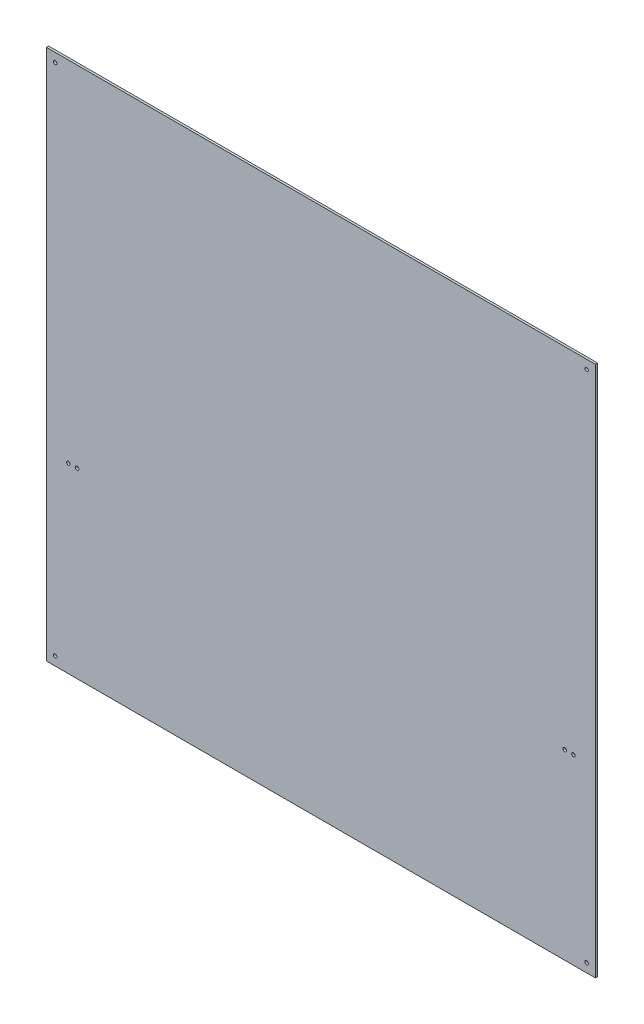
ISO-10303-21;
HEADER;
FILE_DESCRIPTION(('STEP AP214'),'2;1');
FILE_NAME('part.step','',(''),(''),'','','');
FILE_SCHEMA(('AUTOMOTIVE_DESIGN { 1 0 10303 214 1 1 1 1 }'));
ENDSEC;
DATA;
#1=APPLICATION_CONTEXT('core data for automotive mechanical design processes');
#2=APPLICATION_PROTOCOL_DEFINITION('international standard','automotive_design',2000,#1);
#3=PRODUCT_CONTEXT('',#1,'mechanical');
#4=PRODUCT('Part','Part','',(#3));
#5=PRODUCT_RELATED_PRODUCT_CATEGORY('part','',(#4));
#6=PRODUCT_DEFINITION_FORMATION('','',#4);
#7=PRODUCT_DEFINITION_CONTEXT('part definition',#1,'design');
#8=PRODUCT_DEFINITION('design','',#6,#7);
#9=PRODUCT_DEFINITION_SHAPE('','',#8);
#10=(LENGTH_UNIT() NAMED_UNIT(*) SI_UNIT(.MILLI.,.METRE.));
#11=(NAMED_UNIT(*) PLANE_ANGLE_UNIT() SI_UNIT($,.RADIAN.));
#12=(NAMED_UNIT(*) SI_UNIT($,.STERADIAN.) SOLID_ANGLE_UNIT());
#13=UNCERTAINTY_MEASURE_WITH_UNIT(LENGTH_MEASURE(1.E-05),#10,'distance_accuracy_value','');
#14=(GEOMETRIC_REPRESENTATION_CONTEXT(3) GLOBAL_UNCERTAINTY_ASSIGNED_CONTEXT((#13)) GLOBAL_UNIT_ASSIGNED_CONTEXT((#10,
#11,#12)) REPRESENTATION_CONTEXT('',''));
#15=CARTESIAN_POINT('',(0.,0.,0.));
#16=DIRECTION('',(0.,0.,1.));
#17=DIRECTION('',(1.,0.,0.));
#18=AXIS2_PLACEMENT_3D('',#15,#16,#17);
#19=CARTESIAN_POINT('',(-653.566371681416,554.672566371681,5.));
#20=DIRECTION('',(1.,0.,0.));
#21=DIRECTION('',(0.,1.,0.));
#22=AXIS2_PLACEMENT_3D('',#19,#20,#21);
#23=PLANE('',#22);
#24=DIRECTION('',(0.,-1.,0.));
#25=VECTOR('',#24,1.);
#26=CARTESIAN_POINT('',(-653.566371681416,554.672566371681,0.));
#27=LINE('',#26,#25);
#28=CARTESIAN_POINT('',(-653.566371681416,554.672566371681,0.));
#29=VERTEX_POINT('',#28);
#30=CARTESIAN_POINT('',(-653.566371681416,-655.327433628319,0.));
#31=VERTEX_POINT('',#30);
#32=EDGE_CURVE('E98',#29,#31,#27,.T.);
#33=ORIENTED_EDGE('',*,*,#32,.T.);
#34=DIRECTION('',(0.,0.,-1.));
#35=VECTOR('',#34,1.);
#36=CARTESIAN_POINT('',(-653.566371681416,-655.327433628319,5.));
#37=LINE('',#36,#35);
#38=CARTESIAN_POINT('',(-653.566371681416,-655.327433628319,5.));
#39=VERTEX_POINT('',#38);
#40=EDGE_CURVE('E11',#39,#31,#37,.T.);
#41=ORIENTED_EDGE('',*,*,#40,.F.);
#42=DIRECTION('',(0.,-1.,0.));
#43=VECTOR('',#42,1.);
#44=CARTESIAN_POINT('',(-653.566371681416,554.672566371681,5.));
#45=LINE('',#44,#43);
#46=CARTESIAN_POINT('',(-653.566371681416,554.672566371681,5.));
#47=VERTEX_POINT('',#46);
#48=EDGE_CURVE('E84',#47,#39,#45,.T.);
#49=ORIENTED_EDGE('',*,*,#48,.F.);
#50=DIRECTION('',(0.,0.,-1.));
#51=VECTOR('',#50,1.);
#52=CARTESIAN_POINT('',(-653.566371681416,554.672566371681,5.));
#53=LINE('',#52,#51);
#54=EDGE_CURVE('E51',#47,#29,#53,.T.);
#55=ORIENTED_EDGE('',*,*,#54,.T.);
#56=EDGE_LOOP('',(#33,#41,#49,#55));
#57=FACE_BOUND('',#56,.T.);
#58=ADVANCED_FACE('F35',(#57),#23,.F.);
#59=CARTESIAN_POINT('',(-653.566371681416,-655.327433628319,5.));
#60=DIRECTION('',(0.,1.,0.));
#61=DIRECTION('',(0.,0.,1.));
#62=AXIS2_PLACEMENT_3D('',#59,#60,#61);
#63=PLANE('',#62);
#64=DIRECTION('',(1.,0.,0.));
#65=VECTOR('',#64,1.);
#66=CARTESIAN_POINT('',(-653.566371681416,-655.327433628319,0.));
#67=LINE('',#66,#65);
#68=CARTESIAN_POINT('',(596.433628318584,-655.327433628319,0.));
#69=VERTEX_POINT('',#68);
#70=EDGE_CURVE('E89',#31,#69,#67,.T.);
#71=ORIENTED_EDGE('',*,*,#70,.T.);
#72=DIRECTION('',(0.,0.,-1.));
#73=VECTOR('',#72,1.);
#74=CARTESIAN_POINT('',(596.433628318584,-655.327433628319,5.));
#75=LINE('',#74,#73);
#76=CARTESIAN_POINT('',(596.433628318584,-655.327433628319,5.));
#77=VERTEX_POINT('',#76);
#78=EDGE_CURVE('E43',#77,#69,#75,.T.);
#79=ORIENTED_EDGE('',*,*,#78,.F.);
#80=DIRECTION('',(1.,0.,0.));
#81=VECTOR('',#80,1.);
#82=CARTESIAN_POINT('',(-653.566371681416,-655.327433628319,5.));
#83=LINE('',#82,#81);
#84=EDGE_CURVE('E76',#39,#77,#83,.T.);
#85=ORIENTED_EDGE('',*,*,#84,.F.);
#86=ORIENTED_EDGE('',*,*,#40,.T.);
#87=EDGE_LOOP('',(#71,#79,#85,#86));
#88=FACE_BOUND('',#87,.T.);
#89=ADVANCED_FACE('F88',(#88),#63,.F.);
#90=CARTESIAN_POINT('',(596.433628318584,554.672566371681,5.));
#91=DIRECTION('',(1.,0.,0.));
#92=DIRECTION('',(0.,1.,0.));
#93=AXIS2_PLACEMENT_3D('',#90,#91,#92);
#94=PLANE('',#93);
#95=DIRECTION('',(0.,-1.,0.));
#96=VECTOR('',#95,1.);
#97=CARTESIAN_POINT('',(596.433628318584,554.672566371681,0.));
#98=LINE('',#97,#96);
#99=CARTESIAN_POINT('',(596.433628318584,554.672566371681,0.));
#100=VERTEX_POINT('',#99);
#101=EDGE_CURVE('E102',#100,#69,#98,.T.);
#102=ORIENTED_EDGE('',*,*,#101,.F.);
#103=DIRECTION('',(0.,0.,-1.));
#104=VECTOR('',#103,1.);
#105=CARTESIAN_POINT('',(596.433628318584,554.672566371681,5.));
#106=LINE('',#105,#104);
#107=CARTESIAN_POINT('',(596.433628318584,554.672566371681,5.));
#108=VERTEX_POINT('',#107);
#109=EDGE_CURVE('E65',#108,#100,#106,.T.);
#110=ORIENTED_EDGE('',*,*,#109,.F.);
#111=DIRECTION('',(0.,-1.,0.));
#112=VECTOR('',#111,1.);
#113=CARTESIAN_POINT('',(596.433628318584,554.672566371681,5.));
#114=LINE('',#113,#112);
#115=EDGE_CURVE('E83',#108,#77,#114,.T.);
#116=ORIENTED_EDGE('',*,*,#115,.T.);
#117=ORIENTED_EDGE('',*,*,#78,.T.);
#118=EDGE_LOOP('',(#102,#110,#116,#117));
#119=FACE_BOUND('',#118,.T.);
#120=ADVANCED_FACE('F92',(#119),#94,.T.);
#121=CARTESIAN_POINT('',(-653.566371681416,554.672566371681,5.));
#122=DIRECTION('',(0.,1.,0.));
#123=DIRECTION('',(0.,0.,1.));
#124=AXIS2_PLACEMENT_3D('',#121,#122,#123);
#125=PLANE('',#124);
#126=DIRECTION('',(1.,0.,0.));
#127=VECTOR('',#126,1.);
#128=CARTESIAN_POINT('',(-653.566371681416,554.672566371681,0.));
#129=LINE('',#128,#127);
#130=EDGE_CURVE('E104',#29,#100,#129,.T.);
#131=ORIENTED_EDGE('',*,*,#130,.F.);
#132=ORIENTED_EDGE('',*,*,#54,.F.);
#133=DIRECTION('',(1.,0.,0.));
#134=VECTOR('',#133,1.);
#135=CARTESIAN_POINT('',(-653.566371681416,554.672566371681,5.));
#136=LINE('',#135,#134);
#137=EDGE_CURVE('E93',#47,#108,#136,.T.);
#138=ORIENTED_EDGE('',*,*,#137,.T.);
#139=ORIENTED_EDGE('',*,*,#109,.T.);
#140=EDGE_LOOP('',(#131,#132,#138,#139));
#141=FACE_BOUND('',#140,.T.);
#142=ADVANCED_FACE('F170',(#141),#125,.T.);
#143=CARTESIAN_POINT('',(0.,0.,5.));
#144=DIRECTION('',(0.,0.,1.));
#145=DIRECTION('',(1.,0.,0.));
#146=AXIS2_PLACEMENT_3D('',#143,#144,#145);
#147=PLANE('',#146);
#148=CARTESIAN_POINT('',(-603.566371681416,-240.327433628319,5.));
#149=DIRECTION('',(0.,0.,1.));
#150=DIRECTION('',(1.,0.,0.));
#151=AXIS2_PLACEMENT_3D('',#148,#149,#150);
#152=CIRCLE('',#151,4.05000000000002);
#153=CARTESIAN_POINT('',(-599.516371681416,-240.327433628319,5.));
#154=VERTEX_POINT('',#153);
#155=EDGE_CURVE('E152',#154,#154,#152,.T.);
#156=ORIENTED_EDGE('',*,*,#155,.F.);
#157=EDGE_LOOP('',(#156));
#158=FACE_BOUND('',#157,.T.);
#159=CARTESIAN_POINT('',(526.433628318584,-240.327433628319,5.));
#160=DIRECTION('',(0.,0.,1.));
#161=DIRECTION('',(1.,0.,0.));
#162=AXIS2_PLACEMENT_3D('',#159,#160,#161);
#163=CIRCLE('',#162,4.05000000000002);
#164=CARTESIAN_POINT('',(530.483628318584,-240.327433628319,5.));
#165=VERTEX_POINT('',#164);
#166=EDGE_CURVE('E146',#165,#165,#163,.T.);
#167=ORIENTED_EDGE('',*,*,#166,.F.);
#168=EDGE_LOOP('',(#167));
#169=FACE_BOUND('',#168,.T.);
#170=CARTESIAN_POINT('',(-583.566371681416,-240.327433628319,5.));
#171=DIRECTION('',(0.,0.,1.));
#172=DIRECTION('',(1.,0.,0.));
#173=AXIS2_PLACEMENT_3D('',#170,#171,#172);
#174=CIRCLE('',#173,4.05000000000002);
#175=CARTESIAN_POINT('',(-579.516371681416,-240.327433628319,5.));
#176=VERTEX_POINT('',#175);
#177=EDGE_CURVE('E140',#176,#176,#174,.T.);
#178=ORIENTED_EDGE('',*,*,#177,.F.);
#179=EDGE_LOOP('',(#178));
#180=FACE_BOUND('',#179,.T.);
#181=CARTESIAN_POINT('',(546.433628318584,-240.327433628319,5.));
#182=DIRECTION('',(0.,0.,1.));
#183=DIRECTION('',(1.,0.,0.));
#184=AXIS2_PLACEMENT_3D('',#181,#182,#183);
#185=CIRCLE('',#184,4.05000000000002);
#186=CARTESIAN_POINT('',(550.483628318584,-240.327433628319,5.));
#187=VERTEX_POINT('',#186);
#188=EDGE_CURVE('E134',#187,#187,#185,.T.);
#189=ORIENTED_EDGE('',*,*,#188,.F.);
#190=EDGE_LOOP('',(#189));
#191=FACE_BOUND('',#190,.T.);
#192=CARTESIAN_POINT('',(-633.566371681404,-635.327433628319,5.));
#193=DIRECTION('',(0.,0.,1.));
#194=DIRECTION('',(1.,0.,0.));
#195=AXIS2_PLACEMENT_3D('',#192,#193,#194);
#196=CIRCLE('',#195,4.05000000000001);
#197=CARTESIAN_POINT('',(-629.516371681404,-635.327433628319,5.));
#198=VERTEX_POINT('',#197);
#199=EDGE_CURVE('E116',#198,#198,#196,.T.);
#200=ORIENTED_EDGE('',*,*,#199,.F.);
#201=EDGE_LOOP('',(#200));
#202=FACE_BOUND('',#201,.T.);
#203=CARTESIAN_POINT('',(576.433628318596,-635.327433628319,5.));
#204=DIRECTION('',(0.,0.,1.));
#205=DIRECTION('',(1.,0.,0.));
#206=AXIS2_PLACEMENT_3D('',#203,#204,#205);
#207=CIRCLE('',#206,4.05000000000001);
#208=CARTESIAN_POINT('',(580.483628318596,-635.327433628319,5.));
#209=VERTEX_POINT('',#208);
#210=EDGE_CURVE('E123',#209,#209,#207,.T.);
#211=ORIENTED_EDGE('',*,*,#210,.F.);
#212=EDGE_LOOP('',(#211));
#213=FACE_BOUND('',#212,.T.);
#214=CARTESIAN_POINT('',(576.433628318584,534.672566371681,5.));
#215=DIRECTION('',(0.,0.,1.));
#216=DIRECTION('',(1.,0.,0.));
#217=AXIS2_PLACEMENT_3D('',#214,#215,#216);
#218=CIRCLE('',#217,4.05000000000001);
#219=CARTESIAN_POINT('',(580.483628318584,534.672566371681,5.));
#220=VERTEX_POINT('',#219);
#221=EDGE_CURVE('E129',#220,#220,#218,.T.);
#222=ORIENTED_EDGE('',*,*,#221,.F.);
#223=EDGE_LOOP('',(#222));
#224=FACE_BOUND('',#223,.T.);
#225=CARTESIAN_POINT('',(-633.566371681416,534.672566371681,5.));
#226=DIRECTION('',(0.,0.,1.));
#227=DIRECTION('',(1.,0.,0.));
#228=AXIS2_PLACEMENT_3D('',#225,#226,#227);
#229=CIRCLE('',#228,4.05000000000001);
#230=CARTESIAN_POINT('',(-629.516371681416,534.672566371681,5.));
#231=VERTEX_POINT('',#230);
#232=EDGE_CURVE('E110',#231,#231,#229,.T.);
#233=ORIENTED_EDGE('',*,*,#232,.F.);
#234=EDGE_LOOP('',(#233));
#235=FACE_BOUND('',#234,.T.);
#236=ORIENTED_EDGE('',*,*,#48,.T.);
#237=ORIENTED_EDGE('',*,*,#84,.T.);
#238=ORIENTED_EDGE('',*,*,#115,.F.);
#239=ORIENTED_EDGE('',*,*,#137,.F.);
#240=EDGE_LOOP('',(#236,#237,#238,#239));
#241=FACE_BOUND('',#240,.T.);
#242=ADVANCED_FACE('F80',(#158,#169,#180,#191,#202,#213,#224,#235,#241),#147,.T.);
#243=CARTESIAN_POINT('',(0.,0.,0.));
#244=DIRECTION('',(0.,0.,1.));
#245=DIRECTION('',(1.,0.,0.));
#246=AXIS2_PLACEMENT_3D('',#243,#244,#245);
#247=PLANE('',#246);
#248=CARTESIAN_POINT('',(-603.566371681416,-240.327433628319,0.));
#249=DIRECTION('',(0.,0.,1.));
#250=DIRECTION('',(1.,0.,0.));
#251=AXIS2_PLACEMENT_3D('',#248,#249,#250);
#252=CIRCLE('',#251,4.05000000000002);
#253=CARTESIAN_POINT('',(-599.516371681416,-240.327433628319,0.));
#254=VERTEX_POINT('',#253);
#255=EDGE_CURVE('E120',#254,#254,#252,.T.);
#256=ORIENTED_EDGE('',*,*,#255,.T.);
#257=EDGE_LOOP('',(#256));
#258=FACE_BOUND('',#257,.T.);
#259=CARTESIAN_POINT('',(526.433628318584,-240.327433628319,0.));
#260=DIRECTION('',(0.,0.,1.));
#261=DIRECTION('',(1.,0.,0.));
#262=AXIS2_PLACEMENT_3D('',#259,#260,#261);
#263=CIRCLE('',#262,4.05000000000002);
#264=CARTESIAN_POINT('',(530.483628318584,-240.327433628319,0.));
#265=VERTEX_POINT('',#264);
#266=EDGE_CURVE('E149',#265,#265,#263,.T.);
#267=ORIENTED_EDGE('',*,*,#266,.T.);
#268=EDGE_LOOP('',(#267));
#269=FACE_BOUND('',#268,.T.);
#270=CARTESIAN_POINT('',(-583.566371681416,-240.327433628319,0.));
#271=DIRECTION('',(0.,0.,1.));
#272=DIRECTION('',(1.,0.,0.));
#273=AXIS2_PLACEMENT_3D('',#270,#271,#272);
#274=CIRCLE('',#273,4.05000000000002);
#275=CARTESIAN_POINT('',(-579.516371681416,-240.327433628319,0.));
#276=VERTEX_POINT('',#275);
#277=EDGE_CURVE('E143',#276,#276,#274,.T.);
#278=ORIENTED_EDGE('',*,*,#277,.T.);
#279=EDGE_LOOP('',(#278));
#280=FACE_BOUND('',#279,.T.);
#281=CARTESIAN_POINT('',(546.433628318584,-240.327433628319,0.));
#282=DIRECTION('',(0.,0.,1.));
#283=DIRECTION('',(1.,0.,0.));
#284=AXIS2_PLACEMENT_3D('',#281,#282,#283);
#285=CIRCLE('',#284,4.05000000000002);
#286=CARTESIAN_POINT('',(550.483628318584,-240.327433628319,0.));
#287=VERTEX_POINT('',#286);
#288=EDGE_CURVE('E137',#287,#287,#285,.T.);
#289=ORIENTED_EDGE('',*,*,#288,.T.);
#290=EDGE_LOOP('',(#289));
#291=FACE_BOUND('',#290,.T.);
#292=CARTESIAN_POINT('',(-633.566371681404,-635.327433628319,0.));
#293=DIRECTION('',(0.,0.,1.));
#294=DIRECTION('',(1.,0.,0.));
#295=AXIS2_PLACEMENT_3D('',#292,#293,#294);
#296=CIRCLE('',#295,4.05000000000001);
#297=CARTESIAN_POINT('',(-629.516371681404,-635.327433628319,0.));
#298=VERTEX_POINT('',#297);
#299=EDGE_CURVE('E119',#298,#298,#296,.T.);
#300=ORIENTED_EDGE('',*,*,#299,.T.);
#301=EDGE_LOOP('',(#300));
#302=FACE_BOUND('',#301,.T.);
#303=CARTESIAN_POINT('',(576.433628318596,-635.327433628319,0.));
#304=DIRECTION('',(0.,0.,1.));
#305=DIRECTION('',(1.,0.,0.));
#306=AXIS2_PLACEMENT_3D('',#303,#304,#305);
#307=CIRCLE('',#306,4.05000000000001);
#308=CARTESIAN_POINT('',(580.483628318596,-635.327433628319,0.));
#309=VERTEX_POINT('',#308);
#310=EDGE_CURVE('E126',#309,#309,#307,.T.);
#311=ORIENTED_EDGE('',*,*,#310,.T.);
#312=EDGE_LOOP('',(#311));
#313=FACE_BOUND('',#312,.T.);
#314=CARTESIAN_POINT('',(576.433628318584,534.672566371681,0.));
#315=DIRECTION('',(0.,0.,1.));
#316=DIRECTION('',(1.,0.,0.));
#317=AXIS2_PLACEMENT_3D('',#314,#315,#316);
#318=CIRCLE('',#317,4.05000000000001);
#319=CARTESIAN_POINT('',(580.483628318584,534.672566371681,0.));
#320=VERTEX_POINT('',#319);
#321=EDGE_CURVE('E113',#320,#320,#318,.T.);
#322=ORIENTED_EDGE('',*,*,#321,.T.);
#323=EDGE_LOOP('',(#322));
#324=FACE_BOUND('',#323,.T.);
#325=CARTESIAN_POINT('',(-633.566371681416,534.672566371681,0.));
#326=DIRECTION('',(0.,0.,1.));
#327=DIRECTION('',(1.,0.,0.));
#328=AXIS2_PLACEMENT_3D('',#325,#326,#327);
#329=CIRCLE('',#328,4.05000000000001);
#330=CARTESIAN_POINT('',(-629.516371681416,534.672566371681,0.));
#331=VERTEX_POINT('',#330);
#332=EDGE_CURVE('E100',#331,#331,#329,.T.);
#333=ORIENTED_EDGE('',*,*,#332,.T.);
#334=EDGE_LOOP('',(#333));
#335=FACE_BOUND('',#334,.T.);
#336=ORIENTED_EDGE('',*,*,#32,.F.);
#337=ORIENTED_EDGE('',*,*,#130,.T.);
#338=ORIENTED_EDGE('',*,*,#101,.T.);
#339=ORIENTED_EDGE('',*,*,#70,.F.);
#340=EDGE_LOOP('',(#336,#337,#338,#339));
#341=FACE_BOUND('',#340,.T.);
#342=ADVANCED_FACE('F158',(#258,#269,#280,#291,#302,#313,#324,#335,#341),#247,.F.);
#343=CARTESIAN_POINT('',(-633.566371681416,534.672566371681,0.));
#344=DIRECTION('',(0.,0.,1.));
#345=DIRECTION('',(1.,0.,0.));
#346=AXIS2_PLACEMENT_3D('',#343,#344,#345);
#347=CYLINDRICAL_SURFACE('',#346,4.05000000000001);
#348=ORIENTED_EDGE('',*,*,#332,.F.);
#349=EDGE_LOOP('',(#348));
#350=FACE_BOUND('',#349,.T.);
#351=ORIENTED_EDGE('',*,*,#232,.T.);
#352=EDGE_LOOP('',(#351));
#353=FACE_BOUND('',#352,.T.);
#354=ADVANCED_FACE('F186',(#350,#353),#347,.F.);
#355=CARTESIAN_POINT('',(576.433628318584,534.672566371681,0.));
#356=DIRECTION('',(0.,0.,1.));
#357=DIRECTION('',(1.,0.,0.));
#358=AXIS2_PLACEMENT_3D('',#355,#356,#357);
#359=CYLINDRICAL_SURFACE('',#358,4.05000000000001);
#360=ORIENTED_EDGE('',*,*,#321,.F.);
#361=EDGE_LOOP('',(#360));
#362=FACE_BOUND('',#361,.T.);
#363=ORIENTED_EDGE('',*,*,#221,.T.);
#364=EDGE_LOOP('',(#363));
#365=FACE_BOUND('',#364,.T.);
#366=ADVANCED_FACE('F188',(#362,#365),#359,.F.);
#367=CARTESIAN_POINT('',(576.433628318596,-635.327433628319,0.));
#368=DIRECTION('',(0.,0.,1.));
#369=DIRECTION('',(1.,0.,0.));
#370=AXIS2_PLACEMENT_3D('',#367,#368,#369);
#371=CYLINDRICAL_SURFACE('',#370,4.05000000000001);
#372=ORIENTED_EDGE('',*,*,#310,.F.);
#373=EDGE_LOOP('',(#372));
#374=FACE_BOUND('',#373,.T.);
#375=ORIENTED_EDGE('',*,*,#210,.T.);
#376=EDGE_LOOP('',(#375));
#377=FACE_BOUND('',#376,.T.);
#378=ADVANCED_FACE('F195',(#374,#377),#371,.F.);
#379=CARTESIAN_POINT('',(-633.566371681404,-635.327433628319,0.));
#380=DIRECTION('',(0.,0.,1.));
#381=DIRECTION('',(1.,0.,0.));
#382=AXIS2_PLACEMENT_3D('',#379,#380,#381);
#383=CYLINDRICAL_SURFACE('',#382,4.05000000000001);
#384=ORIENTED_EDGE('',*,*,#299,.F.);
#385=EDGE_LOOP('',(#384));
#386=FACE_BOUND('',#385,.T.);
#387=ORIENTED_EDGE('',*,*,#199,.T.);
#388=EDGE_LOOP('',(#387));
#389=FACE_BOUND('',#388,.T.);
#390=ADVANCED_FACE('F258',(#386,#389),#383,.F.);
#391=CARTESIAN_POINT('',(546.433628318584,-240.327433628319,0.));
#392=DIRECTION('',(0.,0.,1.));
#393=DIRECTION('',(1.,0.,0.));
#394=AXIS2_PLACEMENT_3D('',#391,#392,#393);
#395=CYLINDRICAL_SURFACE('',#394,4.05000000000002);
#396=ORIENTED_EDGE('',*,*,#288,.F.);
#397=EDGE_LOOP('',(#396));
#398=FACE_BOUND('',#397,.T.);
#399=ORIENTED_EDGE('',*,*,#188,.T.);
#400=EDGE_LOOP('',(#399));
#401=FACE_BOUND('',#400,.T.);
#402=ADVANCED_FACE('F266',(#398,#401),#395,.F.);
#403=CARTESIAN_POINT('',(-583.566371681416,-240.327433628319,0.));
#404=DIRECTION('',(0.,0.,1.));
#405=DIRECTION('',(1.,0.,0.));
#406=AXIS2_PLACEMENT_3D('',#403,#404,#405);
#407=CYLINDRICAL_SURFACE('',#406,4.05000000000002);
#408=ORIENTED_EDGE('',*,*,#277,.F.);
#409=EDGE_LOOP('',(#408));
#410=FACE_BOUND('',#409,.T.);
#411=ORIENTED_EDGE('',*,*,#177,.T.);
#412=EDGE_LOOP('',(#411));
#413=FACE_BOUND('',#412,.T.);
#414=ADVANCED_FACE('F273',(#410,#413),#407,.F.);
#415=CARTESIAN_POINT('',(526.433628318584,-240.327433628319,0.));
#416=DIRECTION('',(0.,0.,1.));
#417=DIRECTION('',(1.,0.,0.));
#418=AXIS2_PLACEMENT_3D('',#415,#416,#417);
#419=CYLINDRICAL_SURFACE('',#418,4.05000000000002);
#420=ORIENTED_EDGE('',*,*,#266,.F.);
#421=EDGE_LOOP('',(#420));
#422=FACE_BOUND('',#421,.T.);
#423=ORIENTED_EDGE('',*,*,#166,.T.);
#424=EDGE_LOOP('',(#423));
#425=FACE_BOUND('',#424,.T.);
#426=ADVANCED_FACE('F164',(#422,#425),#419,.F.);
#427=CARTESIAN_POINT('',(-603.566371681416,-240.327433628319,0.));
#428=DIRECTION('',(0.,0.,1.));
#429=DIRECTION('',(1.,0.,0.));
#430=AXIS2_PLACEMENT_3D('',#427,#428,#429);
#431=CYLINDRICAL_SURFACE('',#430,4.05000000000002);
#432=ORIENTED_EDGE('',*,*,#255,.F.);
#433=EDGE_LOOP('',(#432));
#434=FACE_BOUND('',#433,.T.);
#435=ORIENTED_EDGE('',*,*,#155,.T.);
#436=EDGE_LOOP('',(#435));
#437=FACE_BOUND('',#436,.T.);
#438=ADVANCED_FACE('F161',(#434,#437),#431,.F.);
#439=CLOSED_SHELL('',(#58,#89,#120,#142,#242,#342,#354,#366,#378,#390,#402,#414,#426,#438));
#440=MANIFOLD_SOLID_BREP('B2',#439);
#441=ADVANCED_BREP_SHAPE_REPRESENTATION('',(#18,#440),#14);
#442=SHAPE_DEFINITION_REPRESENTATION(#9,#441);
ENDSEC;
END-ISO-10303-21;
